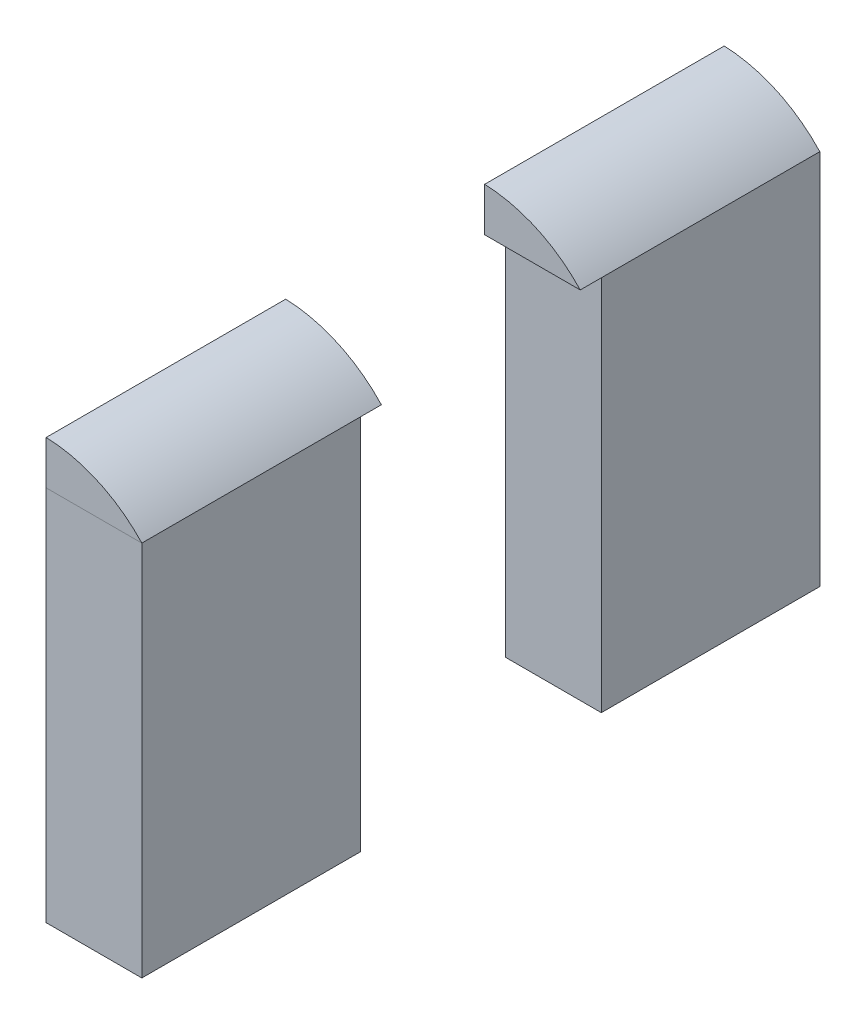
ISO-10303-21;
HEADER;
FILE_DESCRIPTION(('STEP AP214'),'2;1');
FILE_NAME('part.step','',(''),(''),'','','');
FILE_SCHEMA(('AUTOMOTIVE_DESIGN { 1 0 10303 214 1 1 1 1 }'));
ENDSEC;
DATA;
#1=APPLICATION_CONTEXT('core data for automotive mechanical design processes');
#2=APPLICATION_PROTOCOL_DEFINITION('international standard','automotive_design',2000,#1);
#3=PRODUCT_CONTEXT('',#1,'mechanical');
#4=PRODUCT('Part','Part','',(#3));
#5=PRODUCT_RELATED_PRODUCT_CATEGORY('part','',(#4));
#6=PRODUCT_DEFINITION_FORMATION('','',#4);
#7=PRODUCT_DEFINITION_CONTEXT('part definition',#1,'design');
#8=PRODUCT_DEFINITION('design','',#6,#7);
#9=PRODUCT_DEFINITION_SHAPE('','',#8);
#10=(LENGTH_UNIT() NAMED_UNIT(*) SI_UNIT(.MILLI.,.METRE.));
#11=(NAMED_UNIT(*) PLANE_ANGLE_UNIT() SI_UNIT($,.RADIAN.));
#12=(NAMED_UNIT(*) SI_UNIT($,.STERADIAN.) SOLID_ANGLE_UNIT());
#13=UNCERTAINTY_MEASURE_WITH_UNIT(LENGTH_MEASURE(1.E-05),#10,'distance_accuracy_value','');
#14=(GEOMETRIC_REPRESENTATION_CONTEXT(3) GLOBAL_UNCERTAINTY_ASSIGNED_CONTEXT((#13)) GLOBAL_UNIT_ASSIGNED_CONTEXT((#10,
#11,#12)) REPRESENTATION_CONTEXT('',''));
#15=CARTESIAN_POINT('',(0.,0.,0.));
#16=DIRECTION('',(0.,0.,1.));
#17=DIRECTION('',(1.,0.,0.));
#18=AXIS2_PLACEMENT_3D('',#15,#16,#17);
#19=CARTESIAN_POINT('',(0.,0.,56.1));
#20=DIRECTION('',(0.,0.,1.));
#21=DIRECTION('',(1.,0.,0.));
#22=AXIS2_PLACEMENT_3D('',#19,#20,#21);
#23=PLANE('',#22);
#24=DIRECTION('',(-1.,0.,0.));
#25=VECTOR('',#24,1.);
#26=CARTESIAN_POINT('',(54.6,25.1,56.1));
#27=LINE('',#26,#25);
#28=CARTESIAN_POINT('',(54.6,25.1,56.1));
#29=VERTEX_POINT('',#28);
#30=CARTESIAN_POINT('',(41.90671245,25.1,56.1));
#31=VERTEX_POINT('',#30);
#32=EDGE_CURVE('P0_E75',#29,#31,#27,.T.);
#33=ORIENTED_EDGE('',*,*,#32,.F.);
#34=CARTESIAN_POINT('',(41.252136894,12.677846523,56.1));
#35=DIRECTION('',(0.,0.,1.));
#36=DIRECTION('',(1.,0.,0.));
#37=AXIS2_PLACEMENT_3D('',#34,#35,#36);
#38=CIRCLE('',#37,18.233906506);
#39=CARTESIAN_POINT('',(41.90671245,30.9,56.1));
#40=VERTEX_POINT('',#39);
#41=EDGE_CURVE('P0_E83',#29,#40,#38,.T.);
#42=ORIENTED_EDGE('',*,*,#41,.T.);
#43=DIRECTION('',(0.,1.,0.));
#44=VECTOR('',#43,1.);
#45=CARTESIAN_POINT('',(41.90671245,25.1,56.1));
#46=LINE('',#45,#44);
#47=EDGE_CURVE('P0_E30',#31,#40,#46,.T.);
#48=ORIENTED_EDGE('',*,*,#47,.F.);
#49=EDGE_LOOP('',(#33,#42,#48));
#50=FACE_BOUND('',#49,.T.);
#51=ADVANCED_FACE('P0_F19',(#50),#23,.T.);
#52=CARTESIAN_POINT('',(0.,0.,24.3));
#53=DIRECTION('',(0.,0.,1.));
#54=DIRECTION('',(1.,0.,0.));
#55=AXIS2_PLACEMENT_3D('',#52,#53,#54);
#56=PLANE('',#55);
#57=DIRECTION('',(-1.,0.,0.));
#58=VECTOR('',#57,1.);
#59=CARTESIAN_POINT('',(54.6,25.1,24.3));
#60=LINE('',#59,#58);
#61=CARTESIAN_POINT('',(54.6,25.1,24.3));
#62=VERTEX_POINT('',#61);
#63=CARTESIAN_POINT('',(41.90671245,25.1,24.3));
#64=VERTEX_POINT('',#63);
#65=EDGE_CURVE('P0_E23',#62,#64,#60,.T.);
#66=ORIENTED_EDGE('',*,*,#65,.T.);
#67=DIRECTION('',(0.,1.,0.));
#68=VECTOR('',#67,1.);
#69=CARTESIAN_POINT('',(41.90671245,25.1,24.3));
#70=LINE('',#69,#68);
#71=CARTESIAN_POINT('',(41.90671245,30.9,24.3));
#72=VERTEX_POINT('',#71);
#73=EDGE_CURVE('P0_E11',#64,#72,#70,.T.);
#74=ORIENTED_EDGE('',*,*,#73,.T.);
#75=CARTESIAN_POINT('',(41.252136894,12.677846523,24.3));
#76=DIRECTION('',(0.,0.,1.));
#77=DIRECTION('',(1.,0.,0.));
#78=AXIS2_PLACEMENT_3D('',#75,#76,#77);
#79=CIRCLE('',#78,18.233906506);
#80=EDGE_CURVE('P0_E67',#62,#72,#79,.T.);
#81=ORIENTED_EDGE('',*,*,#80,.F.);
#82=EDGE_LOOP('',(#66,#74,#81));
#83=FACE_BOUND('',#82,.T.);
#84=ADVANCED_FACE('P0_F66',(#83),#56,.F.);
#85=CARTESIAN_POINT('',(41.90671245,0.,24.3));
#86=DIRECTION('',(1.,0.,0.));
#87=DIRECTION('',(0.,1.,0.));
#88=AXIS2_PLACEMENT_3D('',#85,#86,#87);
#89=PLANE('',#88);
#90=ORIENTED_EDGE('',*,*,#47,.T.);
#91=DIRECTION('',(0.,0.,1.));
#92=VECTOR('',#91,1.);
#93=CARTESIAN_POINT('',(41.90671245,30.9,24.3));
#94=LINE('',#93,#92);
#95=EDGE_CURVE('P0_E63',#72,#40,#94,.T.);
#96=ORIENTED_EDGE('',*,*,#95,.F.);
#97=ORIENTED_EDGE('',*,*,#73,.F.);
#98=DIRECTION('',(0.,0.,1.));
#99=VECTOR('',#98,1.);
#100=CARTESIAN_POINT('',(41.90671245,25.1,24.3));
#101=LINE('',#100,#99);
#102=EDGE_CURVE('P0_E60',#64,#31,#101,.T.);
#103=ORIENTED_EDGE('',*,*,#102,.T.);
#104=EDGE_LOOP('',(#90,#96,#97,#103));
#105=FACE_BOUND('',#104,.T.);
#106=ADVANCED_FACE('P0_F58',(#105),#89,.F.);
#107=CARTESIAN_POINT('',(41.252136894,12.677846523,24.3));
#108=DIRECTION('',(0.,0.,1.));
#109=DIRECTION('',(1.,0.,0.));
#110=AXIS2_PLACEMENT_3D('',#107,#108,#109);
#111=CYLINDRICAL_SURFACE('',#110,18.233906506);
#112=ORIENTED_EDGE('',*,*,#41,.F.);
#113=DIRECTION('',(0.,0.,1.));
#114=VECTOR('',#113,1.);
#115=CARTESIAN_POINT('',(54.6,25.1,24.3));
#116=LINE('',#115,#114);
#117=EDGE_CURVE('P0_E72',#62,#29,#116,.T.);
#118=ORIENTED_EDGE('',*,*,#117,.F.);
#119=ORIENTED_EDGE('',*,*,#80,.T.);
#120=ORIENTED_EDGE('',*,*,#95,.T.);
#121=EDGE_LOOP('',(#112,#118,#119,#120));
#122=FACE_BOUND('',#121,.T.);
#123=ADVANCED_FACE('P0_F21',(#122),#111,.T.);
#124=CARTESIAN_POINT('',(48.253356225,25.1,24.3));
#125=DIRECTION('',(0.,1.,0.));
#126=DIRECTION('',(1.,0.,0.));
#127=AXIS2_PLACEMENT_3D('',#124,#125,#126);
#128=PLANE('',#127);
#129=ORIENTED_EDGE('',*,*,#32,.T.);
#130=ORIENTED_EDGE('',*,*,#102,.F.);
#131=ORIENTED_EDGE('',*,*,#65,.F.);
#132=ORIENTED_EDGE('',*,*,#117,.T.);
#133=EDGE_LOOP('',(#129,#130,#131,#132));
#134=FACE_BOUND('',#133,.T.);
#135=ADVANCED_FACE('P0_F73',(#134),#128,.F.);
#136=CLOSED_SHELL('',(#51,#84,#106,#123,#135));
#137=MANIFOLD_SOLID_BREP('P0_B1',#136);
#138=CARTESIAN_POINT('',(0.,0.,-33.9));
#139=DIRECTION('',(0.,0.,-1.));
#140=DIRECTION('',(0.,-1.,0.));
#141=AXIS2_PLACEMENT_3D('',#138,#139,#140);
#142=PLANE('',#141);
#143=DIRECTION('',(0.,-1.,0.));
#144=VECTOR('',#143,1.);
#145=CARTESIAN_POINT('',(41.90671245,30.9,-33.9));
#146=LINE('',#145,#144);
#147=CARTESIAN_POINT('',(41.90671245,30.9,-33.9));
#148=VERTEX_POINT('',#147);
#149=CARTESIAN_POINT('',(41.90671245,25.1,-33.9));
#150=VERTEX_POINT('',#149);
#151=EDGE_CURVE('P1_E80',#148,#150,#146,.T.);
#152=ORIENTED_EDGE('',*,*,#151,.F.);
#153=CARTESIAN_POINT('',(41.252136894,12.677846523,-33.9));
#154=DIRECTION('',(0.,0.,-1.));
#155=DIRECTION('',(-1.,0.,0.));
#156=AXIS2_PLACEMENT_3D('',#153,#154,#155);
#157=CIRCLE('',#156,18.233906506);
#158=CARTESIAN_POINT('',(54.6,25.1,-33.9));
#159=VERTEX_POINT('',#158);
#160=EDGE_CURVE('P1_E68',#148,#159,#157,.T.);
#161=ORIENTED_EDGE('',*,*,#160,.T.);
#162=DIRECTION('',(-1.,0.,0.));
#163=VECTOR('',#162,1.);
#164=CARTESIAN_POINT('',(54.6,25.1,-33.9));
#165=LINE('',#164,#163);
#166=EDGE_CURVE('P1_E30',#159,#150,#165,.T.);
#167=ORIENTED_EDGE('',*,*,#166,.T.);
#168=EDGE_LOOP('',(#152,#161,#167));
#169=FACE_BOUND('',#168,.T.);
#170=ADVANCED_FACE('P1_F19',(#169),#142,.T.);
#171=CARTESIAN_POINT('',(0.,0.,-2.1));
#172=DIRECTION('',(0.,0.,-1.));
#173=DIRECTION('',(0.,-1.,0.));
#174=AXIS2_PLACEMENT_3D('',#171,#172,#173);
#175=PLANE('',#174);
#176=DIRECTION('',(0.,-1.,0.));
#177=VECTOR('',#176,1.);
#178=CARTESIAN_POINT('',(41.90671245,30.9,-2.1));
#179=LINE('',#178,#177);
#180=CARTESIAN_POINT('',(41.90671245,30.9,-2.1));
#181=VERTEX_POINT('',#180);
#182=CARTESIAN_POINT('',(41.90671245,25.1,-2.1));
#183=VERTEX_POINT('',#182);
#184=EDGE_CURVE('P1_E81',#181,#183,#179,.T.);
#185=ORIENTED_EDGE('',*,*,#184,.T.);
#186=DIRECTION('',(-1.,0.,0.));
#187=VECTOR('',#186,1.);
#188=CARTESIAN_POINT('',(54.6,25.1,-2.1));
#189=LINE('',#188,#187);
#190=CARTESIAN_POINT('',(54.6,25.1,-2.1));
#191=VERTEX_POINT('',#190);
#192=EDGE_CURVE('P1_E11',#191,#183,#189,.T.);
#193=ORIENTED_EDGE('',*,*,#192,.F.);
#194=CARTESIAN_POINT('',(41.252136894,12.677846523,-2.1));
#195=DIRECTION('',(0.,0.,-1.));
#196=DIRECTION('',(-1.,0.,0.));
#197=AXIS2_PLACEMENT_3D('',#194,#195,#196);
#198=CIRCLE('',#197,18.233906506);
#199=EDGE_CURVE('P1_E23',#181,#191,#198,.T.);
#200=ORIENTED_EDGE('',*,*,#199,.F.);
#201=EDGE_LOOP('',(#185,#193,#200));
#202=FACE_BOUND('',#201,.T.);
#203=ADVANCED_FACE('P1_F99',(#202),#175,.F.);
#204=CARTESIAN_POINT('',(48.253356225,25.1,56.1));
#205=DIRECTION('',(0.,-1.,0.));
#206=DIRECTION('',(0.,0.,-1.));
#207=AXIS2_PLACEMENT_3D('',#204,#205,#206);
#208=PLANE('',#207);
#209=ORIENTED_EDGE('',*,*,#166,.F.);
#210=DIRECTION('',(0.,0.,-1.));
#211=VECTOR('',#210,1.);
#212=CARTESIAN_POINT('',(54.6,25.1,-2.1));
#213=LINE('',#212,#211);
#214=EDGE_CURVE('P1_E74',#191,#159,#213,.T.);
#215=ORIENTED_EDGE('',*,*,#214,.F.);
#216=ORIENTED_EDGE('',*,*,#192,.T.);
#217=DIRECTION('',(0.,0.,-1.));
#218=VECTOR('',#217,1.);
#219=CARTESIAN_POINT('',(41.90671245,25.1,-2.1));
#220=LINE('',#219,#218);
#221=EDGE_CURVE('P1_E84',#183,#150,#220,.T.);
#222=ORIENTED_EDGE('',*,*,#221,.T.);
#223=EDGE_LOOP('',(#209,#215,#216,#222));
#224=FACE_BOUND('',#223,.T.);
#225=ADVANCED_FACE('P1_F100',(#224),#208,.T.);
#226=CARTESIAN_POINT('',(41.252136894,12.677846523,56.1));
#227=DIRECTION('',(0.,0.,-1.));
#228=DIRECTION('',(-1.,0.,0.));
#229=AXIS2_PLACEMENT_3D('',#226,#227,#228);
#230=CYLINDRICAL_SURFACE('',#229,18.233906506);
#231=ORIENTED_EDGE('',*,*,#160,.F.);
#232=DIRECTION('',(0.,0.,-1.));
#233=VECTOR('',#232,1.);
#234=CARTESIAN_POINT('',(41.90671245,30.9,-2.1));
#235=LINE('',#234,#233);
#236=EDGE_CURVE('P1_E72',#181,#148,#235,.T.);
#237=ORIENTED_EDGE('',*,*,#236,.F.);
#238=ORIENTED_EDGE('',*,*,#199,.T.);
#239=ORIENTED_EDGE('',*,*,#214,.T.);
#240=EDGE_LOOP('',(#231,#237,#238,#239));
#241=FACE_BOUND('',#240,.T.);
#242=ADVANCED_FACE('P1_F70',(#241),#230,.T.);
#243=CARTESIAN_POINT('',(41.90671245,0.,56.1));
#244=DIRECTION('',(1.,0.,0.));
#245=DIRECTION('',(0.,1.,0.));
#246=AXIS2_PLACEMENT_3D('',#243,#244,#245);
#247=PLANE('',#246);
#248=ORIENTED_EDGE('',*,*,#151,.T.);
#249=ORIENTED_EDGE('',*,*,#221,.F.);
#250=ORIENTED_EDGE('',*,*,#184,.F.);
#251=ORIENTED_EDGE('',*,*,#236,.T.);
#252=EDGE_LOOP('',(#248,#249,#250,#251));
#253=FACE_BOUND('',#252,.T.);
#254=ADVANCED_FACE('P1_F21',(#253),#247,.F.);
#255=CLOSED_SHELL('',(#170,#203,#225,#242,#254));
#256=MANIFOLD_SOLID_BREP('P1_B1',#255);
#257=CARTESIAN_POINT('',(0.,0.,-33.9));
#258=DIRECTION('',(0.,0.,-1.));
#259=DIRECTION('',(0.,-1.,0.));
#260=AXIS2_PLACEMENT_3D('',#257,#258,#259);
#261=PLANE('',#260);
#262=DIRECTION('',(-1.,0.,0.));
#263=VECTOR('',#262,1.);
#264=CARTESIAN_POINT('',(54.6,25.1,-33.9));
#265=LINE('',#264,#263);
#266=CARTESIAN_POINT('',(54.6,25.1,-33.9));
#267=VERTEX_POINT('',#266);
#268=CARTESIAN_POINT('',(41.90671245,25.1,-33.9));
#269=VERTEX_POINT('',#268);
#270=EDGE_CURVE('P2_E87',#267,#269,#265,.T.);
#271=ORIENTED_EDGE('',*,*,#270,.F.);
#272=DIRECTION('',(0.,1.,0.));
#273=VECTOR('',#272,1.);
#274=CARTESIAN_POINT('',(54.6,-24.9,-33.9));
#275=LINE('',#274,#273);
#276=CARTESIAN_POINT('',(54.6,-24.9,-33.9));
#277=VERTEX_POINT('',#276);
#278=EDGE_CURVE('P2_E21',#277,#267,#275,.T.);
#279=ORIENTED_EDGE('',*,*,#278,.F.);
#280=DIRECTION('',(0.999999829829206,-0.000583387999900361,0.));
#281=VECTOR('',#280,1.);
#282=CARTESIAN_POINT('',(41.90671245,-24.892594881,-33.9));
#283=LINE('',#282,#281);
#284=CARTESIAN_POINT('',(41.90671245,-24.892594881,-33.9));
#285=VERTEX_POINT('',#284);
#286=EDGE_CURVE('P2_E97',#285,#277,#283,.T.);
#287=ORIENTED_EDGE('',*,*,#286,.F.);
#288=DIRECTION('',(0.,-1.,0.));
#289=VECTOR('',#288,1.);
#290=CARTESIAN_POINT('',(41.90671245,25.1,-33.9));
#291=LINE('',#290,#289);
#292=EDGE_CURVE('P2_E28',#269,#285,#291,.T.);
#293=ORIENTED_EDGE('',*,*,#292,.F.);
#294=EDGE_LOOP('',(#271,#279,#287,#293));
#295=FACE_BOUND('',#294,.T.);
#296=ADVANCED_FACE('P2_F18',(#295),#261,.T.);
#297=CARTESIAN_POINT('',(0.,0.,-4.9));
#298=DIRECTION('',(0.,0.,-1.));
#299=DIRECTION('',(0.,-1.,0.));
#300=AXIS2_PLACEMENT_3D('',#297,#298,#299);
#301=PLANE('',#300);
#302=DIRECTION('',(-1.,0.,0.));
#303=VECTOR('',#302,1.);
#304=CARTESIAN_POINT('',(54.6,25.1,-4.9));
#305=LINE('',#304,#303);
#306=CARTESIAN_POINT('',(54.6,25.1,-4.9));
#307=VERTEX_POINT('',#306);
#308=CARTESIAN_POINT('',(41.90671245,25.1,-4.9));
#309=VERTEX_POINT('',#308);
#310=EDGE_CURVE('P2_E78',#307,#309,#305,.T.);
#311=ORIENTED_EDGE('',*,*,#310,.T.);
#312=DIRECTION('',(0.,-1.,0.));
#313=VECTOR('',#312,1.);
#314=CARTESIAN_POINT('',(41.90671245,25.1,-4.9));
#315=LINE('',#314,#313);
#316=CARTESIAN_POINT('',(41.90671245,-24.892594881,-4.9));
#317=VERTEX_POINT('',#316);
#318=EDGE_CURVE('P2_E11',#309,#317,#315,.T.);
#319=ORIENTED_EDGE('',*,*,#318,.T.);
#320=DIRECTION('',(0.999999829829206,-0.000583387999900361,0.));
#321=VECTOR('',#320,1.);
#322=CARTESIAN_POINT('',(41.90671245,-24.892594881,-4.9));
#323=LINE('',#322,#321);
#324=CARTESIAN_POINT('',(54.6,-24.9,-4.9));
#325=VERTEX_POINT('',#324);
#326=EDGE_CURVE('P2_E100',#317,#325,#323,.T.);
#327=ORIENTED_EDGE('',*,*,#326,.T.);
#328=DIRECTION('',(0.,1.,0.));
#329=VECTOR('',#328,1.);
#330=CARTESIAN_POINT('',(54.6,-24.9,-4.9));
#331=LINE('',#330,#329);
#332=EDGE_CURVE('P2_E62',#325,#307,#331,.T.);
#333=ORIENTED_EDGE('',*,*,#332,.T.);
#334=EDGE_LOOP('',(#311,#319,#327,#333));
#335=FACE_BOUND('',#334,.T.);
#336=ADVANCED_FACE('P2_F79',(#335),#301,.F.);
#337=CARTESIAN_POINT('',(41.90671245,0.,-17.9));
#338=DIRECTION('',(1.,0.,0.));
#339=DIRECTION('',(0.,1.,0.));
#340=AXIS2_PLACEMENT_3D('',#337,#338,#339);
#341=PLANE('',#340);
#342=ORIENTED_EDGE('',*,*,#292,.T.);
#343=DIRECTION('',(0.,0.,-1.));
#344=VECTOR('',#343,1.);
#345=CARTESIAN_POINT('',(41.90671245,-24.892594881,-4.9));
#346=LINE('',#345,#344);
#347=EDGE_CURVE('P2_E75',#317,#285,#346,.T.);
#348=ORIENTED_EDGE('',*,*,#347,.F.);
#349=ORIENTED_EDGE('',*,*,#318,.F.);
#350=DIRECTION('',(0.,0.,-1.));
#351=VECTOR('',#350,1.);
#352=CARTESIAN_POINT('',(41.90671245,25.1,-4.9));
#353=LINE('',#352,#351);
#354=EDGE_CURVE('P2_E72',#309,#269,#353,.T.);
#355=ORIENTED_EDGE('',*,*,#354,.T.);
#356=EDGE_LOOP('',(#342,#348,#349,#355));
#357=FACE_BOUND('',#356,.T.);
#358=ADVANCED_FACE('P2_F70',(#357),#341,.F.);
#359=CARTESIAN_POINT('',(48.253356225,-24.896297441,-17.9));
#360=DIRECTION('',(0.000583387999900361,0.999999829829206,0.));
#361=DIRECTION('',(0.,0.,-1.));
#362=AXIS2_PLACEMENT_3D('',#359,#360,#361);
#363=PLANE('',#362);
#364=ORIENTED_EDGE('',*,*,#286,.T.);
#365=DIRECTION('',(0.,0.,-1.));
#366=VECTOR('',#365,1.);
#367=CARTESIAN_POINT('',(54.6,-24.9,-4.9));
#368=LINE('',#367,#366);
#369=EDGE_CURVE('P2_E101',#325,#277,#368,.T.);
#370=ORIENTED_EDGE('',*,*,#369,.F.);
#371=ORIENTED_EDGE('',*,*,#326,.F.);
#372=ORIENTED_EDGE('',*,*,#347,.T.);
#373=EDGE_LOOP('',(#364,#370,#371,#372));
#374=FACE_BOUND('',#373,.T.);
#375=ADVANCED_FACE('P2_F113',(#374),#363,.F.);
#376=CARTESIAN_POINT('',(54.6,0.1,-17.9));
#377=DIRECTION('',(-1.,0.,0.));
#378=DIRECTION('',(0.,0.,1.));
#379=AXIS2_PLACEMENT_3D('',#376,#377,#378);
#380=PLANE('',#379);
#381=ORIENTED_EDGE('',*,*,#278,.T.);
#382=DIRECTION('',(0.,0.,-1.));
#383=VECTOR('',#382,1.);
#384=CARTESIAN_POINT('',(54.6,25.1,-4.9));
#385=LINE('',#384,#383);
#386=EDGE_CURVE('P2_E83',#307,#267,#385,.T.);
#387=ORIENTED_EDGE('',*,*,#386,.F.);
#388=ORIENTED_EDGE('',*,*,#332,.F.);
#389=ORIENTED_EDGE('',*,*,#369,.T.);
#390=EDGE_LOOP('',(#381,#387,#388,#389));
#391=FACE_BOUND('',#390,.T.);
#392=ADVANCED_FACE('P2_F117',(#391),#380,.F.);
#393=CARTESIAN_POINT('',(48.253356225,25.1,-17.9));
#394=DIRECTION('',(0.,-1.,0.));
#395=DIRECTION('',(0.,0.,-1.));
#396=AXIS2_PLACEMENT_3D('',#393,#394,#395);
#397=PLANE('',#396);
#398=ORIENTED_EDGE('',*,*,#270,.T.);
#399=ORIENTED_EDGE('',*,*,#354,.F.);
#400=ORIENTED_EDGE('',*,*,#310,.F.);
#401=ORIENTED_EDGE('',*,*,#386,.T.);
#402=EDGE_LOOP('',(#398,#399,#400,#401));
#403=FACE_BOUND('',#402,.T.);
#404=ADVANCED_FACE('P2_F85',(#403),#397,.F.);
#405=CLOSED_SHELL('',(#296,#336,#358,#375,#392,#404));
#406=MANIFOLD_SOLID_BREP('P2_B1',#405);
#407=CARTESIAN_POINT('',(0.,0.,27.1));
#408=DIRECTION('',(0.,0.,-1.));
#409=DIRECTION('',(0.,-1.,0.));
#410=AXIS2_PLACEMENT_3D('',#407,#408,#409);
#411=PLANE('',#410);
#412=DIRECTION('',(-1.,0.,0.));
#413=VECTOR('',#412,1.);
#414=CARTESIAN_POINT('',(54.6,25.1,27.1));
#415=LINE('',#414,#413);
#416=CARTESIAN_POINT('',(54.6,25.1,27.1));
#417=VERTEX_POINT('',#416);
#418=CARTESIAN_POINT('',(41.90671245,25.1,27.1));
#419=VERTEX_POINT('',#418);
#420=EDGE_CURVE('P3_E118',#417,#419,#415,.T.);
#421=ORIENTED_EDGE('',*,*,#420,.F.);
#422=DIRECTION('',(0.,1.,0.));
#423=VECTOR('',#422,1.);
#424=CARTESIAN_POINT('',(54.6,-24.9,27.1));
#425=LINE('',#424,#423);
#426=CARTESIAN_POINT('',(54.6,-24.9,27.1));
#427=VERTEX_POINT('',#426);
#428=EDGE_CURVE('P3_E90',#427,#417,#425,.T.);
#429=ORIENTED_EDGE('',*,*,#428,.F.);
#430=DIRECTION('',(0.999999829829206,-0.000583387999900361,0.));
#431=VECTOR('',#430,1.);
#432=CARTESIAN_POINT('',(41.90671245,-24.892594881,27.1));
#433=LINE('',#432,#431);
#434=CARTESIAN_POINT('',(41.90671245,-24.892594881,27.1));
#435=VERTEX_POINT('',#434);
#436=EDGE_CURVE('P3_E76',#435,#427,#433,.T.);
#437=ORIENTED_EDGE('',*,*,#436,.F.);
#438=DIRECTION('',(0.,-1.,0.));
#439=VECTOR('',#438,1.);
#440=CARTESIAN_POINT('',(41.90671245,25.1,27.1));
#441=LINE('',#440,#439);
#442=EDGE_CURVE('P3_E29',#419,#435,#441,.T.);
#443=ORIENTED_EDGE('',*,*,#442,.F.);
#444=EDGE_LOOP('',(#421,#429,#437,#443));
#445=FACE_BOUND('',#444,.T.);
#446=ADVANCED_FACE('P3_F18',(#445),#411,.T.);
#447=CARTESIAN_POINT('',(0.,0.,56.1));
#448=DIRECTION('',(0.,0.,-1.));
#449=DIRECTION('',(0.,-1.,0.));
#450=AXIS2_PLACEMENT_3D('',#447,#448,#449);
#451=PLANE('',#450);
#452=DIRECTION('',(-1.,0.,0.));
#453=VECTOR('',#452,1.);
#454=CARTESIAN_POINT('',(54.6,25.1,56.1));
#455=LINE('',#454,#453);
#456=CARTESIAN_POINT('',(54.6,25.1,56.1));
#457=VERTEX_POINT('',#456);
#458=CARTESIAN_POINT('',(41.90671245,25.1,56.1));
#459=VERTEX_POINT('',#458);
#460=EDGE_CURVE('P3_E101',#457,#459,#455,.T.);
#461=ORIENTED_EDGE('',*,*,#460,.T.);
#462=DIRECTION('',(0.,-1.,0.));
#463=VECTOR('',#462,1.);
#464=CARTESIAN_POINT('',(41.90671245,25.1,56.1));
#465=LINE('',#464,#463);
#466=CARTESIAN_POINT('',(41.90671245,-24.892594881,56.1));
#467=VERTEX_POINT('',#466);
#468=EDGE_CURVE('P3_E11',#459,#467,#465,.T.);
#469=ORIENTED_EDGE('',*,*,#468,.T.);
#470=DIRECTION('',(0.999999829829206,-0.000583387999900361,0.));
#471=VECTOR('',#470,1.);
#472=CARTESIAN_POINT('',(41.90671245,-24.892594881,56.1));
#473=LINE('',#472,#471);
#474=CARTESIAN_POINT('',(54.6,-24.9,56.1));
#475=VERTEX_POINT('',#474);
#476=EDGE_CURVE('P3_E66',#467,#475,#473,.T.);
#477=ORIENTED_EDGE('',*,*,#476,.T.);
#478=DIRECTION('',(0.,1.,0.));
#479=VECTOR('',#478,1.);
#480=CARTESIAN_POINT('',(54.6,-24.9,56.1));
#481=LINE('',#480,#479);
#482=EDGE_CURVE('P3_E70',#475,#457,#481,.T.);
#483=ORIENTED_EDGE('',*,*,#482,.T.);
#484=EDGE_LOOP('',(#461,#469,#477,#483));
#485=FACE_BOUND('',#484,.T.);
#486=ADVANCED_FACE('P3_F68',(#485),#451,.F.);
#487=CARTESIAN_POINT('',(41.90671245,0.,56.1));
#488=DIRECTION('',(1.,0.,0.));
#489=DIRECTION('',(0.,1.,0.));
#490=AXIS2_PLACEMENT_3D('',#487,#488,#489);
#491=PLANE('',#490);
#492=ORIENTED_EDGE('',*,*,#442,.T.);
#493=DIRECTION('',(0.,0.,-1.));
#494=VECTOR('',#493,1.);
#495=CARTESIAN_POINT('',(41.90671245,-24.892594881,56.1));
#496=LINE('',#495,#494);
#497=EDGE_CURVE('P3_E75',#467,#435,#496,.T.);
#498=ORIENTED_EDGE('',*,*,#497,.F.);
#499=ORIENTED_EDGE('',*,*,#468,.F.);
#500=DIRECTION('',(0.,0.,-1.));
#501=VECTOR('',#500,1.);
#502=CARTESIAN_POINT('',(41.90671245,25.1,56.1));
#503=LINE('',#502,#501);
#504=EDGE_CURVE('P3_E22',#459,#419,#503,.T.);
#505=ORIENTED_EDGE('',*,*,#504,.T.);
#506=EDGE_LOOP('',(#492,#498,#499,#505));
#507=FACE_BOUND('',#506,.T.);
#508=ADVANCED_FACE('P3_F128',(#507),#491,.F.);
#509=CARTESIAN_POINT('',(48.253356225,-24.896297441,56.1));
#510=DIRECTION('',(0.000583387999900361,0.999999829829206,0.));
#511=DIRECTION('',(0.,0.,-1.));
#512=AXIS2_PLACEMENT_3D('',#509,#510,#511);
#513=PLANE('',#512);
#514=ORIENTED_EDGE('',*,*,#436,.T.);
#515=DIRECTION('',(0.,0.,-1.));
#516=VECTOR('',#515,1.);
#517=CARTESIAN_POINT('',(54.6,-24.9,56.1));
#518=LINE('',#517,#516);
#519=EDGE_CURVE('P3_E79',#475,#427,#518,.T.);
#520=ORIENTED_EDGE('',*,*,#519,.F.);
#521=ORIENTED_EDGE('',*,*,#476,.F.);
#522=ORIENTED_EDGE('',*,*,#497,.T.);
#523=EDGE_LOOP('',(#514,#520,#521,#522));
#524=FACE_BOUND('',#523,.T.);
#525=ADVANCED_FACE('P3_F80',(#524),#513,.F.);
#526=CARTESIAN_POINT('',(54.6,0.1,56.1));
#527=DIRECTION('',(-1.,0.,0.));
#528=DIRECTION('',(0.,0.,1.));
#529=AXIS2_PLACEMENT_3D('',#526,#527,#528);
#530=PLANE('',#529);
#531=ORIENTED_EDGE('',*,*,#428,.T.);
#532=DIRECTION('',(0.,0.,-1.));
#533=VECTOR('',#532,1.);
#534=CARTESIAN_POINT('',(54.6,25.1,56.1));
#535=LINE('',#534,#533);
#536=EDGE_CURVE('P3_E87',#457,#417,#535,.T.);
#537=ORIENTED_EDGE('',*,*,#536,.F.);
#538=ORIENTED_EDGE('',*,*,#482,.F.);
#539=ORIENTED_EDGE('',*,*,#519,.T.);
#540=EDGE_LOOP('',(#531,#537,#538,#539));
#541=FACE_BOUND('',#540,.T.);
#542=ADVANCED_FACE('P3_F20',(#541),#530,.F.);
#543=CARTESIAN_POINT('',(48.253356225,25.1,56.1));
#544=DIRECTION('',(0.,-1.,0.));
#545=DIRECTION('',(0.,0.,-1.));
#546=AXIS2_PLACEMENT_3D('',#543,#544,#545);
#547=PLANE('',#546);
#548=ORIENTED_EDGE('',*,*,#420,.T.);
#549=ORIENTED_EDGE('',*,*,#504,.F.);
#550=ORIENTED_EDGE('',*,*,#460,.F.);
#551=ORIENTED_EDGE('',*,*,#536,.T.);
#552=EDGE_LOOP('',(#548,#549,#550,#551));
#553=FACE_BOUND('',#552,.T.);
#554=ADVANCED_FACE('P3_F129',(#553),#547,.F.);
#555=CLOSED_SHELL('',(#446,#486,#508,#525,#542,#554));
#556=MANIFOLD_SOLID_BREP('P3_B1',#555);
#557=ADVANCED_BREP_SHAPE_REPRESENTATION('',(#18,#137,#256,#406,#556),#14);
#558=SHAPE_DEFINITION_REPRESENTATION(#9,#557);
ENDSEC;
END-ISO-10303-21;
